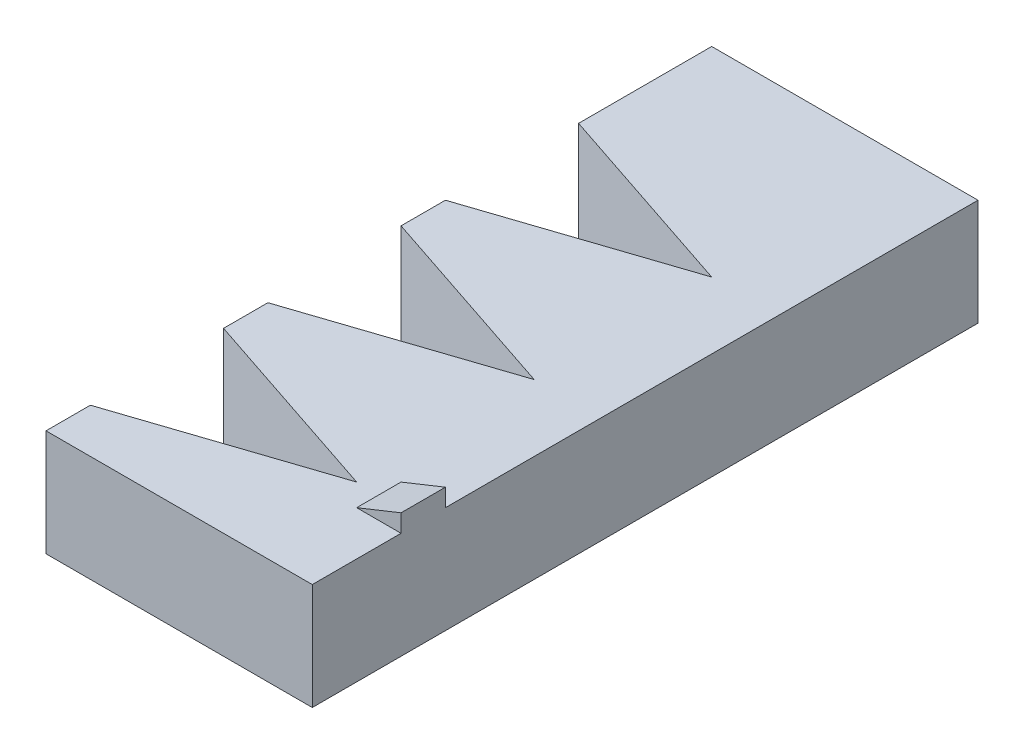
ISO-10303-21;
HEADER;
FILE_DESCRIPTION(('STEP AP214'),'2;1');
FILE_NAME('part.step','',(''),(''),'','','');
FILE_SCHEMA(('AUTOMOTIVE_DESIGN { 1 0 10303 214 1 1 1 1 }'));
ENDSEC;
DATA;
#1=APPLICATION_CONTEXT('core data for automotive mechanical design processes');
#2=APPLICATION_PROTOCOL_DEFINITION('international standard','automotive_design',2000,#1);
#3=PRODUCT_CONTEXT('',#1,'mechanical');
#4=PRODUCT('Part','Part','',(#3));
#5=PRODUCT_RELATED_PRODUCT_CATEGORY('part','',(#4));
#6=PRODUCT_DEFINITION_FORMATION('','',#4);
#7=PRODUCT_DEFINITION_CONTEXT('part definition',#1,'design');
#8=PRODUCT_DEFINITION('design','',#6,#7);
#9=PRODUCT_DEFINITION_SHAPE('','',#8);
#10=(LENGTH_UNIT() NAMED_UNIT(*) SI_UNIT(.MILLI.,.METRE.));
#11=(NAMED_UNIT(*) PLANE_ANGLE_UNIT() SI_UNIT($,.RADIAN.));
#12=(NAMED_UNIT(*) SI_UNIT($,.STERADIAN.) SOLID_ANGLE_UNIT());
#13=UNCERTAINTY_MEASURE_WITH_UNIT(LENGTH_MEASURE(1.E-05),#10,'distance_accuracy_value','');
#14=(GEOMETRIC_REPRESENTATION_CONTEXT(3) GLOBAL_UNCERTAINTY_ASSIGNED_CONTEXT((#13)) GLOBAL_UNIT_ASSIGNED_CONTEXT((#10,
#11,#12)) REPRESENTATION_CONTEXT('',''));
#15=CARTESIAN_POINT('',(0.,0.,0.));
#16=DIRECTION('',(0.,0.,1.));
#17=DIRECTION('',(1.,0.,0.));
#18=AXIS2_PLACEMENT_3D('',#15,#16,#17);
#19=CARTESIAN_POINT('',(0.,12.,0.));
#20=DIRECTION('',(0.,-1.,0.));
#21=DIRECTION('',(0.,0.,-1.));
#22=AXIS2_PLACEMENT_3D('',#19,#20,#21);
#23=PLANE('',#22);
#24=DIRECTION('',(1.,0.,0.));
#25=VECTOR('',#24,1.);
#26=CARTESIAN_POINT('',(27.5,12.,-10.));
#27=LINE('',#26,#25);
#28=CARTESIAN_POINT('',(25.,12.,-10.));
#29=VERTEX_POINT('',#28);
#30=CARTESIAN_POINT('',(30.,12.,-10.));
#31=VERTEX_POINT('',#30);
#32=EDGE_CURVE('E100',#29,#31,#27,.T.);
#33=ORIENTED_EDGE('',*,*,#32,.F.);
#34=DIRECTION('',(0.,0.,1.));
#35=VECTOR('',#34,1.);
#36=CARTESIAN_POINT('',(25.,12.,-12.5));
#37=LINE('',#36,#35);
#38=CARTESIAN_POINT('',(25.,12.,-15.));
#39=VERTEX_POINT('',#38);
#40=EDGE_CURVE('E194',#39,#29,#37,.T.);
#41=ORIENTED_EDGE('',*,*,#40,.F.);
#42=DIRECTION('',(-1.,0.,0.));
#43=VECTOR('',#42,1.);
#44=CARTESIAN_POINT('',(27.5,12.,-15.));
#45=LINE('',#44,#43);
#46=CARTESIAN_POINT('',(30.,12.,-15.));
#47=VERTEX_POINT('',#46);
#48=EDGE_CURVE('E106',#47,#39,#45,.T.);
#49=ORIENTED_EDGE('',*,*,#48,.F.);
#50=DIRECTION('',(0.,0.,-1.));
#51=VECTOR('',#50,1.);
#52=CARTESIAN_POINT('',(30.,12.,0.));
#53=LINE('',#52,#51);
#54=CARTESIAN_POINT('',(30.,12.,-75.));
#55=VERTEX_POINT('',#54);
#56=EDGE_CURVE('E291',#47,#55,#53,.T.);
#57=ORIENTED_EDGE('',*,*,#56,.T.);
#58=DIRECTION('',(-1.,0.,0.));
#59=VECTOR('',#58,1.);
#60=CARTESIAN_POINT('',(0.,12.,-75.));
#61=LINE('',#60,#59);
#62=CARTESIAN_POINT('',(0.,12.,-75.));
#63=VERTEX_POINT('',#62);
#64=EDGE_CURVE('E294',#55,#63,#61,.T.);
#65=ORIENTED_EDGE('',*,*,#64,.T.);
#66=DIRECTION('',(0.,0.,1.));
#67=VECTOR('',#66,1.);
#68=CARTESIAN_POINT('',(0.,12.,0.));
#69=LINE('',#68,#67);
#70=CARTESIAN_POINT('',(0.,12.,-60.));
#71=VERTEX_POINT('',#70);
#72=EDGE_CURVE('E283',#63,#71,#69,.T.);
#73=ORIENTED_EDGE('',*,*,#72,.T.);
#74=DIRECTION('',(0.948683298050514,0.,0.316227766016838));
#75=VECTOR('',#74,1.);
#76=CARTESIAN_POINT('',(22.5,12.,-52.5));
#77=LINE('',#76,#75);
#78=CARTESIAN_POINT('',(22.5,12.,-52.5));
#79=VERTEX_POINT('',#78);
#80=EDGE_CURVE('E246',#71,#79,#77,.T.);
#81=ORIENTED_EDGE('',*,*,#80,.T.);
#82=DIRECTION('',(-0.948683298050514,0.,0.316227766016838));
#83=VECTOR('',#82,1.);
#84=CARTESIAN_POINT('',(0.,12.,-45.));
#85=LINE('',#84,#83);
#86=CARTESIAN_POINT('',(0.,12.,-45.));
#87=VERTEX_POINT('',#86);
#88=EDGE_CURVE('E231',#79,#87,#85,.T.);
#89=ORIENTED_EDGE('',*,*,#88,.T.);
#90=CARTESIAN_POINT('',(0.,12.,-40.));
#91=VERTEX_POINT('',#90);
#92=EDGE_CURVE('E287',#87,#91,#69,.T.);
#93=ORIENTED_EDGE('',*,*,#92,.T.);
#94=DIRECTION('',(0.948683298050514,0.,0.316227766016838));
#95=VECTOR('',#94,1.);
#96=CARTESIAN_POINT('',(22.5,12.,-32.5));
#97=LINE('',#96,#95);
#98=CARTESIAN_POINT('',(22.5,12.,-32.5));
#99=VERTEX_POINT('',#98);
#100=EDGE_CURVE('E226',#91,#99,#97,.T.);
#101=ORIENTED_EDGE('',*,*,#100,.T.);
#102=DIRECTION('',(-0.948683298050514,0.,0.316227766016838));
#103=VECTOR('',#102,1.);
#104=CARTESIAN_POINT('',(0.,12.,-25.));
#105=LINE('',#104,#103);
#106=CARTESIAN_POINT('',(0.,12.,-25.));
#107=VERTEX_POINT('',#106);
#108=EDGE_CURVE('E222',#99,#107,#105,.T.);
#109=ORIENTED_EDGE('',*,*,#108,.T.);
#110=CARTESIAN_POINT('',(0.,12.,-20.));
#111=VERTEX_POINT('',#110);
#112=EDGE_CURVE('E288',#107,#111,#69,.T.);
#113=ORIENTED_EDGE('',*,*,#112,.T.);
#114=DIRECTION('',(0.948683298050514,0.,0.316227766016838));
#115=VECTOR('',#114,1.);
#116=CARTESIAN_POINT('',(22.5,12.,-12.5));
#117=LINE('',#116,#115);
#118=CARTESIAN_POINT('',(22.5,12.,-12.5));
#119=VERTEX_POINT('',#118);
#120=EDGE_CURVE('E266',#111,#119,#117,.T.);
#121=ORIENTED_EDGE('',*,*,#120,.T.);
#122=DIRECTION('',(-0.948683298050514,0.,0.316227766016838));
#123=VECTOR('',#122,1.);
#124=CARTESIAN_POINT('',(0.,12.,-5.));
#125=LINE('',#124,#123);
#126=CARTESIAN_POINT('',(0.,12.,-5.));
#127=VERTEX_POINT('',#126);
#128=EDGE_CURVE('E262',#119,#127,#125,.T.);
#129=ORIENTED_EDGE('',*,*,#128,.T.);
#130=CARTESIAN_POINT('',(0.,12.,0.));
#131=VERTEX_POINT('',#130);
#132=EDGE_CURVE('E289',#127,#131,#69,.T.);
#133=ORIENTED_EDGE('',*,*,#132,.T.);
#134=DIRECTION('',(1.,0.,0.));
#135=VECTOR('',#134,1.);
#136=CARTESIAN_POINT('',(0.,12.,0.));
#137=LINE('',#136,#135);
#138=CARTESIAN_POINT('',(30.,12.,0.));
#139=VERTEX_POINT('',#138);
#140=EDGE_CURVE('E286',#131,#139,#137,.T.);
#141=ORIENTED_EDGE('',*,*,#140,.T.);
#142=EDGE_CURVE('E292',#139,#31,#53,.T.);
#143=ORIENTED_EDGE('',*,*,#142,.T.);
#144=EDGE_LOOP('',(#33,#41,#49,#57,#65,#73,#81,#89,#93,#101,#109,#113,#121,#129,#133,#141,#143));
#145=FACE_BOUND('',#144,.T.);
#146=ADVANCED_FACE('F85',(#145),#23,.F.);
#147=CARTESIAN_POINT('',(0.,12.,0.));
#148=DIRECTION('',(1.,0.,0.));
#149=DIRECTION('',(0.,0.,-1.));
#150=AXIS2_PLACEMENT_3D('',#147,#148,#149);
#151=PLANE('',#150);
#152=DIRECTION('',(0.,-1.,0.));
#153=VECTOR('',#152,1.);
#154=CARTESIAN_POINT('',(0.,39.0416345659799,-40.));
#155=LINE('',#154,#153);
#156=CARTESIAN_POINT('',(0.,0.,-40.));
#157=VERTEX_POINT('',#156);
#158=EDGE_CURVE('E234',#91,#157,#155,.T.);
#159=ORIENTED_EDGE('',*,*,#158,.F.);
#160=ORIENTED_EDGE('',*,*,#92,.F.);
#161=DIRECTION('',(0.,-1.,0.));
#162=VECTOR('',#161,1.);
#163=CARTESIAN_POINT('',(0.,39.0416345659799,-45.));
#164=LINE('',#163,#162);
#165=CARTESIAN_POINT('',(0.,0.,-45.));
#166=VERTEX_POINT('',#165);
#167=EDGE_CURVE('E257',#87,#166,#164,.T.);
#168=ORIENTED_EDGE('',*,*,#167,.T.);
#169=DIRECTION('',(0.,0.,1.));
#170=VECTOR('',#169,1.);
#171=CARTESIAN_POINT('',(0.,0.,0.));
#172=LINE('',#171,#170);
#173=EDGE_CURVE('E301',#166,#157,#172,.T.);
#174=ORIENTED_EDGE('',*,*,#173,.T.);
#175=EDGE_LOOP('',(#159,#160,#168,#174));
#176=FACE_BOUND('',#175,.T.);
#177=ADVANCED_FACE('F87',(#176),#151,.F.);
#178=DIRECTION('',(0.,-1.,0.));
#179=VECTOR('',#178,1.);
#180=CARTESIAN_POINT('',(0.,39.0416345659799,-25.));
#181=LINE('',#180,#179);
#182=CARTESIAN_POINT('',(0.,0.,-25.));
#183=VERTEX_POINT('',#182);
#184=EDGE_CURVE('E239',#107,#183,#181,.T.);
#185=ORIENTED_EDGE('',*,*,#184,.T.);
#186=CARTESIAN_POINT('',(0.,0.,-20.));
#187=VERTEX_POINT('',#186);
#188=EDGE_CURVE('E302',#183,#187,#172,.T.);
#189=ORIENTED_EDGE('',*,*,#188,.T.);
#190=DIRECTION('',(0.,-1.,0.));
#191=VECTOR('',#190,1.);
#192=CARTESIAN_POINT('',(0.,39.0416345659799,-20.));
#193=LINE('',#192,#191);
#194=EDGE_CURVE('E272',#111,#187,#193,.T.);
#195=ORIENTED_EDGE('',*,*,#194,.F.);
#196=ORIENTED_EDGE('',*,*,#112,.F.);
#197=EDGE_LOOP('',(#185,#189,#195,#196));
#198=FACE_BOUND('',#197,.T.);
#199=ADVANCED_FACE('F349',(#198),#151,.F.);
#200=DIRECTION('',(0.,-1.,0.));
#201=VECTOR('',#200,1.);
#202=CARTESIAN_POINT('',(0.,39.0416345659799,-60.));
#203=LINE('',#202,#201);
#204=CARTESIAN_POINT('',(0.,0.,-60.));
#205=VERTEX_POINT('',#204);
#206=EDGE_CURVE('E252',#71,#205,#203,.T.);
#207=ORIENTED_EDGE('',*,*,#206,.F.);
#208=ORIENTED_EDGE('',*,*,#72,.F.);
#209=DIRECTION('',(0.,-1.,0.));
#210=VECTOR('',#209,1.);
#211=CARTESIAN_POINT('',(0.,12.,-75.));
#212=LINE('',#211,#210);
#213=CARTESIAN_POINT('',(0.,0.,-75.));
#214=VERTEX_POINT('',#213);
#215=EDGE_CURVE('E296',#63,#214,#212,.T.);
#216=ORIENTED_EDGE('',*,*,#215,.T.);
#217=EDGE_CURVE('E297',#214,#205,#172,.T.);
#218=ORIENTED_EDGE('',*,*,#217,.T.);
#219=EDGE_LOOP('',(#207,#208,#216,#218));
#220=FACE_BOUND('',#219,.T.);
#221=ADVANCED_FACE('F334',(#220),#151,.F.);
#222=CARTESIAN_POINT('',(0.,0.,0.));
#223=DIRECTION('',(0.,-1.,0.));
#224=DIRECTION('',(0.,0.,-1.));
#225=AXIS2_PLACEMENT_3D('',#222,#223,#224);
#226=PLANE('',#225);
#227=DIRECTION('',(0.948683298050514,0.,-0.316227766016838));
#228=VECTOR('',#227,1.);
#229=CARTESIAN_POINT('',(0.,0.,-25.));
#230=LINE('',#229,#228);
#231=CARTESIAN_POINT('',(22.5,0.,-32.5));
#232=VERTEX_POINT('',#231);
#233=EDGE_CURVE('E227',#183,#232,#230,.T.);
#234=ORIENTED_EDGE('',*,*,#233,.T.);
#235=DIRECTION('',(-0.948683298050514,0.,-0.316227766016838));
#236=VECTOR('',#235,1.);
#237=CARTESIAN_POINT('',(22.5,0.,-32.5));
#238=LINE('',#237,#236);
#239=EDGE_CURVE('E230',#232,#157,#238,.T.);
#240=ORIENTED_EDGE('',*,*,#239,.T.);
#241=ORIENTED_EDGE('',*,*,#173,.F.);
#242=DIRECTION('',(0.948683298050514,0.,-0.316227766016838));
#243=VECTOR('',#242,1.);
#244=CARTESIAN_POINT('',(0.,0.,-45.));
#245=LINE('',#244,#243);
#246=CARTESIAN_POINT('',(22.5,0.,-52.5));
#247=VERTEX_POINT('',#246);
#248=EDGE_CURVE('E208',#166,#247,#245,.T.);
#249=ORIENTED_EDGE('',*,*,#248,.T.);
#250=DIRECTION('',(-0.948683298050514,0.,-0.316227766016838));
#251=VECTOR('',#250,1.);
#252=CARTESIAN_POINT('',(22.5,0.,-52.5));
#253=LINE('',#252,#251);
#254=EDGE_CURVE('E249',#247,#205,#253,.T.);
#255=ORIENTED_EDGE('',*,*,#254,.T.);
#256=ORIENTED_EDGE('',*,*,#217,.F.);
#257=DIRECTION('',(-1.,0.,0.));
#258=VECTOR('',#257,1.);
#259=CARTESIAN_POINT('',(0.,0.,-75.));
#260=LINE('',#259,#258);
#261=CARTESIAN_POINT('',(30.,0.,-75.));
#262=VERTEX_POINT('',#261);
#263=EDGE_CURVE('E306',#262,#214,#260,.T.);
#264=ORIENTED_EDGE('',*,*,#263,.F.);
#265=DIRECTION('',(0.,0.,-1.));
#266=VECTOR('',#265,1.);
#267=CARTESIAN_POINT('',(30.,0.,0.));
#268=LINE('',#267,#266);
#269=CARTESIAN_POINT('',(30.,0.,0.));
#270=VERTEX_POINT('',#269);
#271=EDGE_CURVE('E304',#270,#262,#268,.T.);
#272=ORIENTED_EDGE('',*,*,#271,.F.);
#273=DIRECTION('',(1.,0.,0.));
#274=VECTOR('',#273,1.);
#275=CARTESIAN_POINT('',(0.,0.,0.));
#276=LINE('',#275,#274);
#277=CARTESIAN_POINT('',(0.,0.,0.));
#278=VERTEX_POINT('',#277);
#279=EDGE_CURVE('E300',#278,#270,#276,.T.);
#280=ORIENTED_EDGE('',*,*,#279,.F.);
#281=CARTESIAN_POINT('',(0.,0.,-5.));
#282=VERTEX_POINT('',#281);
#283=EDGE_CURVE('E265',#282,#278,#172,.T.);
#284=ORIENTED_EDGE('',*,*,#283,.F.);
#285=DIRECTION('',(0.948683298050514,0.,-0.316227766016838));
#286=VECTOR('',#285,1.);
#287=CARTESIAN_POINT('',(0.,0.,-5.));
#288=LINE('',#287,#286);
#289=CARTESIAN_POINT('',(22.5,0.,-12.5));
#290=VERTEX_POINT('',#289);
#291=EDGE_CURVE('E225',#282,#290,#288,.T.);
#292=ORIENTED_EDGE('',*,*,#291,.T.);
#293=DIRECTION('',(-0.948683298050514,0.,-0.316227766016838));
#294=VECTOR('',#293,1.);
#295=CARTESIAN_POINT('',(22.5,0.,-12.5));
#296=LINE('',#295,#294);
#297=EDGE_CURVE('E269',#290,#187,#296,.T.);
#298=ORIENTED_EDGE('',*,*,#297,.T.);
#299=ORIENTED_EDGE('',*,*,#188,.F.);
#300=EDGE_LOOP('',(#234,#240,#241,#249,#255,#256,#264,#272,#280,#284,#292,#298,#299));
#301=FACE_BOUND('',#300,.T.);
#302=ADVANCED_FACE('F324',(#301),#226,.T.);
#303=DIRECTION('',(0.,-1.,0.));
#304=VECTOR('',#303,1.);
#305=CARTESIAN_POINT('',(0.,39.0416345659799,-5.));
#306=LINE('',#305,#304);
#307=EDGE_CURVE('E278',#127,#282,#306,.T.);
#308=ORIENTED_EDGE('',*,*,#307,.T.);
#309=ORIENTED_EDGE('',*,*,#283,.T.);
#310=DIRECTION('',(0.,-1.,0.));
#311=VECTOR('',#310,1.);
#312=CARTESIAN_POINT('',(0.,12.,0.));
#313=LINE('',#312,#311);
#314=EDGE_CURVE('E13',#131,#278,#313,.T.);
#315=ORIENTED_EDGE('',*,*,#314,.F.);
#316=ORIENTED_EDGE('',*,*,#132,.F.);
#317=EDGE_LOOP('',(#308,#309,#315,#316));
#318=FACE_BOUND('',#317,.T.);
#319=ADVANCED_FACE('F351',(#318),#151,.F.);
#320=CARTESIAN_POINT('',(0.,12.,0.));
#321=DIRECTION('',(0.,0.,-1.));
#322=DIRECTION('',(-1.,0.,0.));
#323=AXIS2_PLACEMENT_3D('',#320,#321,#322);
#324=PLANE('',#323);
#325=ORIENTED_EDGE('',*,*,#279,.T.);
#326=DIRECTION('',(0.,-1.,0.));
#327=VECTOR('',#326,1.);
#328=CARTESIAN_POINT('',(30.,12.,0.));
#329=LINE('',#328,#327);
#330=EDGE_CURVE('E93',#139,#270,#329,.T.);
#331=ORIENTED_EDGE('',*,*,#330,.F.);
#332=ORIENTED_EDGE('',*,*,#140,.F.);
#333=ORIENTED_EDGE('',*,*,#314,.T.);
#334=EDGE_LOOP('',(#325,#331,#332,#333));
#335=FACE_BOUND('',#334,.T.);
#336=ADVANCED_FACE('F362',(#335),#324,.F.);
#337=CARTESIAN_POINT('',(30.,12.,0.));
#338=DIRECTION('',(-1.,0.,0.));
#339=DIRECTION('',(0.,0.,1.));
#340=AXIS2_PLACEMENT_3D('',#337,#338,#339);
#341=PLANE('',#340);
#342=ORIENTED_EDGE('',*,*,#271,.T.);
#343=DIRECTION('',(0.,-1.,0.));
#344=VECTOR('',#343,1.);
#345=CARTESIAN_POINT('',(30.,12.,-75.));
#346=LINE('',#345,#344);
#347=EDGE_CURVE('E310',#55,#262,#346,.T.);
#348=ORIENTED_EDGE('',*,*,#347,.F.);
#349=ORIENTED_EDGE('',*,*,#56,.F.);
#350=DIRECTION('',(0.,1.,0.));
#351=VECTOR('',#350,1.);
#352=CARTESIAN_POINT('',(30.,13.,-15.));
#353=LINE('',#352,#351);
#354=CARTESIAN_POINT('',(30.,14.,-15.));
#355=VERTEX_POINT('',#354);
#356=EDGE_CURVE('E207',#47,#355,#353,.T.);
#357=ORIENTED_EDGE('',*,*,#356,.T.);
#358=DIRECTION('',(0.,0.,1.));
#359=VECTOR('',#358,1.);
#360=CARTESIAN_POINT('',(30.,14.,-12.5));
#361=LINE('',#360,#359);
#362=CARTESIAN_POINT('',(30.,14.,-10.));
#363=VERTEX_POINT('',#362);
#364=EDGE_CURVE('E212',#355,#363,#361,.T.);
#365=ORIENTED_EDGE('',*,*,#364,.T.);
#366=DIRECTION('',(0.,-1.,0.));
#367=VECTOR('',#366,1.);
#368=CARTESIAN_POINT('',(30.,13.,-10.));
#369=LINE('',#368,#367);
#370=EDGE_CURVE('E219',#363,#31,#369,.T.);
#371=ORIENTED_EDGE('',*,*,#370,.T.);
#372=ORIENTED_EDGE('',*,*,#142,.F.);
#373=ORIENTED_EDGE('',*,*,#330,.T.);
#374=EDGE_LOOP('',(#342,#348,#349,#357,#365,#371,#372,#373));
#375=FACE_BOUND('',#374,.T.);
#376=ADVANCED_FACE('F317',(#375),#341,.F.);
#377=CARTESIAN_POINT('',(0.,12.,-75.));
#378=DIRECTION('',(0.,0.,1.));
#379=DIRECTION('',(1.,0.,0.));
#380=AXIS2_PLACEMENT_3D('',#377,#378,#379);
#381=PLANE('',#380);
#382=ORIENTED_EDGE('',*,*,#263,.T.);
#383=ORIENTED_EDGE('',*,*,#215,.F.);
#384=ORIENTED_EDGE('',*,*,#64,.F.);
#385=ORIENTED_EDGE('',*,*,#347,.T.);
#386=EDGE_LOOP('',(#382,#383,#384,#385));
#387=FACE_BOUND('',#386,.T.);
#388=ADVANCED_FACE('F329',(#387),#381,.F.);
#389=CARTESIAN_POINT('',(22.5,39.0416345659799,-12.5));
#390=DIRECTION('',(-0.316227766016838,0.,0.948683298050514));
#391=DIRECTION('',(0.948683298050514,0.,0.316227766016838));
#392=AXIS2_PLACEMENT_3D('',#389,#390,#391);
#393=PLANE('',#392);
#394=ORIENTED_EDGE('',*,*,#194,.T.);
#395=ORIENTED_EDGE('',*,*,#297,.F.);
#396=DIRECTION('',(0.,-1.,0.));
#397=VECTOR('',#396,1.);
#398=CARTESIAN_POINT('',(22.5,39.0416345659799,-12.5));
#399=LINE('',#398,#397);
#400=EDGE_CURVE('E275',#119,#290,#399,.T.);
#401=ORIENTED_EDGE('',*,*,#400,.F.);
#402=ORIENTED_EDGE('',*,*,#120,.F.);
#403=EDGE_LOOP('',(#394,#395,#401,#402));
#404=FACE_BOUND('',#403,.T.);
#405=ADVANCED_FACE('F360',(#404),#393,.T.);
#406=CARTESIAN_POINT('',(0.,39.0416345659799,-5.));
#407=DIRECTION('',(-0.316227766016838,0.,-0.948683298050514));
#408=DIRECTION('',(-0.948683298050514,0.,0.316227766016838));
#409=AXIS2_PLACEMENT_3D('',#406,#407,#408);
#410=PLANE('',#409);
#411=ORIENTED_EDGE('',*,*,#400,.T.);
#412=ORIENTED_EDGE('',*,*,#291,.F.);
#413=ORIENTED_EDGE('',*,*,#307,.F.);
#414=ORIENTED_EDGE('',*,*,#128,.F.);
#415=EDGE_LOOP('',(#411,#412,#413,#414));
#416=FACE_BOUND('',#415,.T.);
#417=ADVANCED_FACE('F354',(#416),#410,.T.);
#418=CARTESIAN_POINT('',(22.5,39.0416345659799,-52.5));
#419=DIRECTION('',(-0.316227766016838,0.,0.948683298050514));
#420=DIRECTION('',(0.948683298050514,0.,0.316227766016838));
#421=AXIS2_PLACEMENT_3D('',#418,#419,#420);
#422=PLANE('',#421);
#423=ORIENTED_EDGE('',*,*,#206,.T.);
#424=ORIENTED_EDGE('',*,*,#254,.F.);
#425=DIRECTION('',(0.,-1.,0.));
#426=VECTOR('',#425,1.);
#427=CARTESIAN_POINT('',(22.5,39.0416345659799,-52.5));
#428=LINE('',#427,#426);
#429=EDGE_CURVE('E254',#79,#247,#428,.T.);
#430=ORIENTED_EDGE('',*,*,#429,.F.);
#431=ORIENTED_EDGE('',*,*,#80,.F.);
#432=EDGE_LOOP('',(#423,#424,#430,#431));
#433=FACE_BOUND('',#432,.T.);
#434=ADVANCED_FACE('F392',(#433),#422,.T.);
#435=CARTESIAN_POINT('',(0.,39.0416345659799,-45.));
#436=DIRECTION('',(-0.316227766016838,0.,-0.948683298050514));
#437=DIRECTION('',(-0.948683298050514,0.,0.316227766016838));
#438=AXIS2_PLACEMENT_3D('',#435,#436,#437);
#439=PLANE('',#438);
#440=ORIENTED_EDGE('',*,*,#429,.T.);
#441=ORIENTED_EDGE('',*,*,#248,.F.);
#442=ORIENTED_EDGE('',*,*,#167,.F.);
#443=ORIENTED_EDGE('',*,*,#88,.F.);
#444=EDGE_LOOP('',(#440,#441,#442,#443));
#445=FACE_BOUND('',#444,.T.);
#446=ADVANCED_FACE('F394',(#445),#439,.T.);
#447=CARTESIAN_POINT('',(22.5,39.0416345659799,-32.5));
#448=DIRECTION('',(-0.316227766016838,0.,0.948683298050514));
#449=DIRECTION('',(0.948683298050514,0.,0.316227766016838));
#450=AXIS2_PLACEMENT_3D('',#447,#448,#449);
#451=PLANE('',#450);
#452=ORIENTED_EDGE('',*,*,#158,.T.);
#453=ORIENTED_EDGE('',*,*,#239,.F.);
#454=DIRECTION('',(0.,-1.,0.));
#455=VECTOR('',#454,1.);
#456=CARTESIAN_POINT('',(22.5,39.0416345659799,-32.5));
#457=LINE('',#456,#455);
#458=EDGE_CURVE('E236',#99,#232,#457,.T.);
#459=ORIENTED_EDGE('',*,*,#458,.F.);
#460=ORIENTED_EDGE('',*,*,#100,.F.);
#461=EDGE_LOOP('',(#452,#453,#459,#460));
#462=FACE_BOUND('',#461,.T.);
#463=ADVANCED_FACE('F378',(#462),#451,.T.);
#464=CARTESIAN_POINT('',(0.,39.0416345659799,-25.));
#465=DIRECTION('',(-0.316227766016838,0.,-0.948683298050514));
#466=DIRECTION('',(-0.948683298050514,0.,0.316227766016838));
#467=AXIS2_PLACEMENT_3D('',#464,#465,#466);
#468=PLANE('',#467);
#469=ORIENTED_EDGE('',*,*,#458,.T.);
#470=ORIENTED_EDGE('',*,*,#233,.F.);
#471=ORIENTED_EDGE('',*,*,#184,.F.);
#472=ORIENTED_EDGE('',*,*,#108,.F.);
#473=EDGE_LOOP('',(#469,#470,#471,#472));
#474=FACE_BOUND('',#473,.T.);
#475=ADVANCED_FACE('F380',(#474),#468,.T.);
#476=CARTESIAN_POINT('',(30.,12.,-15.));
#477=DIRECTION('',(0.,0.,-1.));
#478=DIRECTION('',(-1.,0.,0.));
#479=AXIS2_PLACEMENT_3D('',#476,#477,#478);
#480=PLANE('',#479);
#481=ORIENTED_EDGE('',*,*,#48,.T.);
#482=DIRECTION('',(0.928476690885259,0.371390676354104,0.));
#483=VECTOR('',#482,1.);
#484=CARTESIAN_POINT('',(27.5,13.,-15.));
#485=LINE('',#484,#483);
#486=EDGE_CURVE('E199',#39,#355,#485,.T.);
#487=ORIENTED_EDGE('',*,*,#486,.T.);
#488=ORIENTED_EDGE('',*,*,#356,.F.);
#489=EDGE_LOOP('',(#481,#487,#488));
#490=FACE_BOUND('',#489,.T.);
#491=ADVANCED_FACE('F205',(#490),#480,.T.);
#492=CARTESIAN_POINT('',(25.,12.,-15.));
#493=DIRECTION('',(-0.371390676354104,0.928476690885259,0.));
#494=DIRECTION('',(0.,0.,1.));
#495=AXIS2_PLACEMENT_3D('',#492,#493,#494);
#496=PLANE('',#495);
#497=ORIENTED_EDGE('',*,*,#40,.T.);
#498=DIRECTION('',(0.928476690885259,0.371390676354104,0.));
#499=VECTOR('',#498,1.);
#500=CARTESIAN_POINT('',(27.5,13.,-10.));
#501=LINE('',#500,#499);
#502=EDGE_CURVE('E200',#29,#363,#501,.T.);
#503=ORIENTED_EDGE('',*,*,#502,.T.);
#504=ORIENTED_EDGE('',*,*,#364,.F.);
#505=ORIENTED_EDGE('',*,*,#486,.F.);
#506=EDGE_LOOP('',(#497,#503,#504,#505));
#507=FACE_BOUND('',#506,.T.);
#508=ADVANCED_FACE('F210',(#507),#496,.T.);
#509=CARTESIAN_POINT('',(25.,12.,-10.));
#510=DIRECTION('',(0.,0.,1.));
#511=DIRECTION('',(1.,0.,0.));
#512=AXIS2_PLACEMENT_3D('',#509,#510,#511);
#513=PLANE('',#512);
#514=ORIENTED_EDGE('',*,*,#32,.T.);
#515=ORIENTED_EDGE('',*,*,#370,.F.);
#516=ORIENTED_EDGE('',*,*,#502,.F.);
#517=EDGE_LOOP('',(#514,#515,#516));
#518=FACE_BOUND('',#517,.T.);
#519=ADVANCED_FACE('F336',(#518),#513,.T.);
#520=CLOSED_SHELL('',(#146,#177,#199,#221,#302,#319,#336,#376,#388,#405,#417,#434,#446,#463,
#475,#491,#508,#519));
#521=MANIFOLD_SOLID_BREP('B2',#520);
#522=ADVANCED_BREP_SHAPE_REPRESENTATION('',(#18,#521),#14);
#523=SHAPE_DEFINITION_REPRESENTATION(#9,#522);
ENDSEC;
END-ISO-10303-21;
